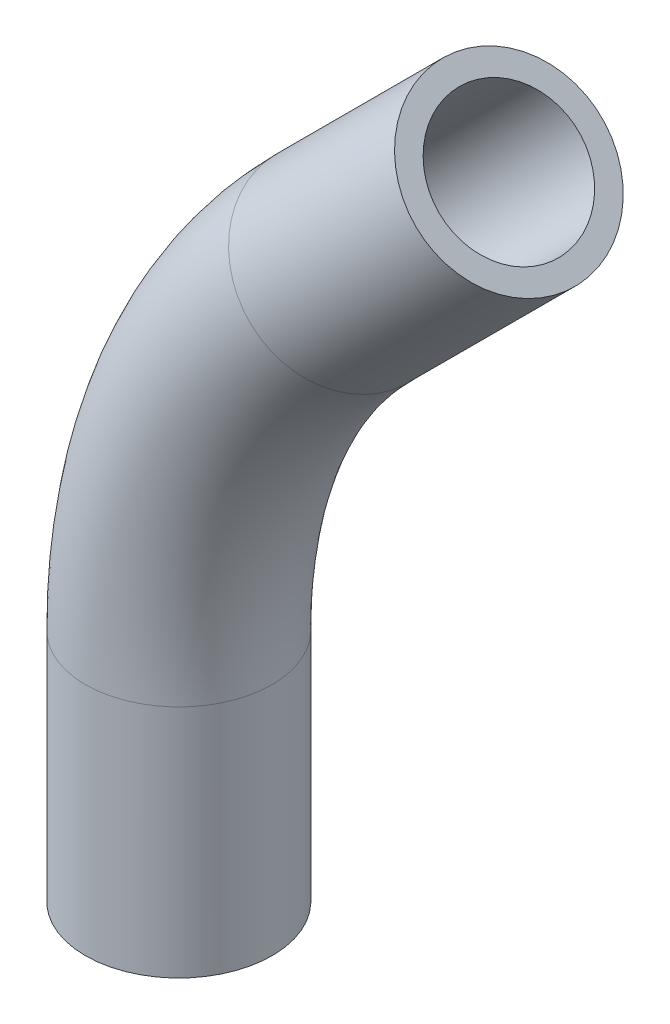
ISO-10303-21;
HEADER;
FILE_DESCRIPTION(('STEP AP214'),'2;1');
FILE_NAME('part.step','',(''),(''),'','','');
FILE_SCHEMA(('AUTOMOTIVE_DESIGN { 1 0 10303 214 1 1 1 1 }'));
ENDSEC;
DATA;
#1=APPLICATION_CONTEXT('core data for automotive mechanical design processes');
#2=APPLICATION_PROTOCOL_DEFINITION('international standard','automotive_design',2000,#1);
#3=PRODUCT_CONTEXT('',#1,'mechanical');
#4=PRODUCT('Part','Part','',(#3));
#5=PRODUCT_RELATED_PRODUCT_CATEGORY('part','',(#4));
#6=PRODUCT_DEFINITION_FORMATION('','',#4);
#7=PRODUCT_DEFINITION_CONTEXT('part definition',#1,'design');
#8=PRODUCT_DEFINITION('design','',#6,#7);
#9=PRODUCT_DEFINITION_SHAPE('','',#8);
#10=(LENGTH_UNIT() NAMED_UNIT(*) SI_UNIT(.MILLI.,.METRE.));
#11=(NAMED_UNIT(*) PLANE_ANGLE_UNIT() SI_UNIT($,.RADIAN.));
#12=(NAMED_UNIT(*) SI_UNIT($,.STERADIAN.) SOLID_ANGLE_UNIT());
#13=UNCERTAINTY_MEASURE_WITH_UNIT(LENGTH_MEASURE(1.E-05),#10,'distance_accuracy_value','');
#14=(GEOMETRIC_REPRESENTATION_CONTEXT(3) GLOBAL_UNCERTAINTY_ASSIGNED_CONTEXT((#13)) GLOBAL_UNIT_ASSIGNED_CONTEXT((#10,
#11,#12)) REPRESENTATION_CONTEXT('',''));
#15=CARTESIAN_POINT('',(0.,0.,0.));
#16=DIRECTION('',(0.,0.,1.));
#17=DIRECTION('',(1.,0.,0.));
#18=AXIS2_PLACEMENT_3D('',#15,#16,#17);
#19=CARTESIAN_POINT('',(0.,0.,0.));
#20=DIRECTION('',(0.,1.,0.));
#21=DIRECTION('',(0.,0.,1.));
#22=AXIS2_PLACEMENT_3D('',#19,#20,#21);
#23=CYLINDRICAL_SURFACE('',#22,4.);
#24=CARTESIAN_POINT('',(0.,10.0588745030457,0.));
#25=DIRECTION('',(0.,1.,0.));
#26=DIRECTION('',(0.,0.,1.));
#27=AXIS2_PLACEMENT_3D('',#24,#25,#26);
#28=CIRCLE('',#27,4.);
#29=CARTESIAN_POINT('',(-4.,10.0588745030457,0.));
#30=VERTEX_POINT('',#29);
#31=EDGE_CURVE('E80',#30,#30,#28,.T.);
#32=ORIENTED_EDGE('',*,*,#31,.F.);
#33=EDGE_LOOP('',(#32));
#34=FACE_BOUND('',#33,.T.);
#35=CARTESIAN_POINT('',(0.,0.,0.));
#36=DIRECTION('',(0.,1.,0.));
#37=DIRECTION('',(0.,0.,1.));
#38=AXIS2_PLACEMENT_3D('',#35,#36,#37);
#39=CIRCLE('',#38,4.);
#40=CARTESIAN_POINT('',(0.,0.,4.));
#41=VERTEX_POINT('',#40);
#42=EDGE_CURVE('E49',#41,#41,#39,.T.);
#43=ORIENTED_EDGE('',*,*,#42,.T.);
#44=EDGE_LOOP('',(#43));
#45=FACE_BOUND('',#44,.T.);
#46=ADVANCED_FACE('F34',(#34,#45),#23,.T.);
#47=CARTESIAN_POINT('',(24.,10.0588745030457,0.));
#48=DIRECTION('',(0.,0.,-1.));
#49=DIRECTION('',(-1.,0.,0.));
#50=AXIS2_PLACEMENT_3D('',#47,#48,#49);
#51=TOROIDAL_SURFACE('',#50,24.,4.);
#52=CARTESIAN_POINT('',(7.02943725152288,27.0294372515229,0.));
#53=DIRECTION('',(0.707106781186548,0.707106781186547,0.));
#54=DIRECTION('',(0.,0.,1.));
#55=AXIS2_PLACEMENT_3D('',#52,#53,#54);
#56=CIRCLE('',#55,4.);
#57=CARTESIAN_POINT('',(4.20101012677669,29.8578643762691,0.));
#58=VERTEX_POINT('',#57);
#59=EDGE_CURVE('E38',#58,#58,#56,.T.);
#60=CARTESIAN_POINT('',(24.,10.0588745030457,0.));
#61=DIRECTION('',(0.,0.,-1.));
#62=DIRECTION('',(-1.,0.,0.));
#63=AXIS2_PLACEMENT_3D('',#60,#61,#62);
#64=CIRCLE('',#63,28.);
#65=EDGE_CURVE('',#30,#58,#64,.T.);
#66=ORIENTED_EDGE('',*,*,#31,.T.);
#67=ORIENTED_EDGE('',*,*,#59,.F.);
#68=ORIENTED_EDGE('',*,*,#65,.T.);
#69=ORIENTED_EDGE('',*,*,#65,.F.);
#70=EDGE_LOOP('',(#66,#68,#67,#69));
#71=FACE_BOUND('',#70,.T.);
#72=ADVANCED_FACE('F88',(#71),#51,.T.);
#73=CARTESIAN_POINT('',(7.02943725152288,27.0294372515229,0.));
#74=DIRECTION('',(0.707106781186548,0.707106781186547,0.));
#75=DIRECTION('',(-0.707106781186547,0.707106781186548,0.));
#76=AXIS2_PLACEMENT_3D('',#73,#74,#75);
#77=CYLINDRICAL_SURFACE('',#76,4.);
#78=CARTESIAN_POINT('',(14.142135623731,34.1421356237309,0.));
#79=DIRECTION('',(0.707106781186548,0.707106781186547,0.));
#80=DIRECTION('',(0.,0.,1.));
#81=AXIS2_PLACEMENT_3D('',#78,#79,#80);
#82=CIRCLE('',#81,4.);
#83=CARTESIAN_POINT('',(14.142135623731,34.1421356237309,4.));
#84=VERTEX_POINT('',#83);
#85=EDGE_CURVE('E54',#84,#84,#82,.T.);
#86=ORIENTED_EDGE('',*,*,#85,.F.);
#87=EDGE_LOOP('',(#86));
#88=FACE_BOUND('',#87,.T.);
#89=ORIENTED_EDGE('',*,*,#59,.T.);
#90=EDGE_LOOP('',(#89));
#91=FACE_BOUND('',#90,.T.);
#92=ADVANCED_FACE('F36',(#88,#91),#77,.T.);
#93=CARTESIAN_POINT('',(0.,0.,0.));
#94=DIRECTION('',(0.,1.,0.));
#95=DIRECTION('',(0.,0.,1.));
#96=AXIS2_PLACEMENT_3D('',#93,#94,#95);
#97=PLANE('',#96);
#98=CARTESIAN_POINT('',(0.,0.,0.));
#99=DIRECTION('',(0.,1.,0.));
#100=DIRECTION('',(0.,0.,1.));
#101=AXIS2_PLACEMENT_3D('',#98,#99,#100);
#102=CIRCLE('',#101,3.);
#103=CARTESIAN_POINT('',(0.,0.,3.));
#104=VERTEX_POINT('',#103);
#105=EDGE_CURVE('E75',#104,#104,#102,.F.);
#106=ORIENTED_EDGE('',*,*,#105,.F.);
#107=EDGE_LOOP('',(#106));
#108=FACE_BOUND('',#107,.T.);
#109=ORIENTED_EDGE('',*,*,#42,.F.);
#110=EDGE_LOOP('',(#109));
#111=FACE_BOUND('',#110,.T.);
#112=ADVANCED_FACE('F94',(#108,#111),#97,.F.);
#113=CARTESIAN_POINT('',(14.142135623731,34.1421356237309,0.));
#114=DIRECTION('',(0.707106781186548,0.707106781186547,0.));
#115=DIRECTION('',(0.,0.,1.));
#116=AXIS2_PLACEMENT_3D('',#113,#114,#115);
#117=PLANE('',#116);
#118=CARTESIAN_POINT('',(14.142135623731,34.1421356237309,0.));
#119=DIRECTION('',(0.707106781186548,0.707106781186547,0.));
#120=DIRECTION('',(0.,0.,1.));
#121=AXIS2_PLACEMENT_3D('',#118,#119,#120);
#122=CIRCLE('',#121,3.);
#123=CARTESIAN_POINT('',(14.142135623731,34.1421356237309,3.));
#124=VERTEX_POINT('',#123);
#125=EDGE_CURVE('E11',#124,#124,#122,.F.);
#126=ORIENTED_EDGE('',*,*,#125,.T.);
#127=EDGE_LOOP('',(#126));
#128=FACE_BOUND('',#127,.T.);
#129=ORIENTED_EDGE('',*,*,#85,.T.);
#130=EDGE_LOOP('',(#129));
#131=FACE_BOUND('',#130,.T.);
#132=ADVANCED_FACE('F61',(#128,#131),#117,.T.);
#133=CARTESIAN_POINT('',(0.,0.,0.));
#134=DIRECTION('',(0.,1.,0.));
#135=DIRECTION('',(0.,0.,1.));
#136=AXIS2_PLACEMENT_3D('',#133,#134,#135);
#137=CYLINDRICAL_SURFACE('',#136,3.);
#138=CARTESIAN_POINT('',(0.,10.0588745030457,0.));
#139=DIRECTION('',(0.,1.,0.));
#140=DIRECTION('',(0.,0.,1.));
#141=AXIS2_PLACEMENT_3D('',#138,#139,#140);
#142=CIRCLE('',#141,3.);
#143=CARTESIAN_POINT('',(-3.,10.0588745030457,0.));
#144=VERTEX_POINT('',#143);
#145=EDGE_CURVE('E72',#144,#144,#142,.F.);
#146=ORIENTED_EDGE('',*,*,#145,.F.);
#147=EDGE_LOOP('',(#146));
#148=FACE_BOUND('',#147,.T.);
#149=ORIENTED_EDGE('',*,*,#105,.T.);
#150=EDGE_LOOP('',(#149));
#151=FACE_BOUND('',#150,.T.);
#152=ADVANCED_FACE('F102',(#148,#151),#137,.F.);
#153=CARTESIAN_POINT('',(24.,10.0588745030457,0.));
#154=DIRECTION('',(0.,0.,-1.));
#155=DIRECTION('',(-1.,0.,0.));
#156=AXIS2_PLACEMENT_3D('',#153,#154,#155);
#157=TOROIDAL_SURFACE('',#156,24.,3.);
#158=CARTESIAN_POINT('',(7.02943725152288,27.0294372515229,0.));
#159=DIRECTION('',(0.707106781186548,0.707106781186547,0.));
#160=DIRECTION('',(0.,0.,1.));
#161=AXIS2_PLACEMENT_3D('',#158,#159,#160);
#162=CIRCLE('',#161,3.);
#163=CARTESIAN_POINT('',(4.90811690796324,29.1507575950825,0.));
#164=VERTEX_POINT('',#163);
#165=EDGE_CURVE('E43',#164,#164,#162,.F.);
#166=CARTESIAN_POINT('',(24.,10.0588745030457,0.));
#167=DIRECTION('',(0.,0.,-1.));
#168=DIRECTION('',(-1.,0.,0.));
#169=AXIS2_PLACEMENT_3D('',#166,#167,#168);
#170=CIRCLE('',#169,27.);
#171=EDGE_CURVE('',#144,#164,#170,.T.);
#172=ORIENTED_EDGE('',*,*,#145,.T.);
#173=ORIENTED_EDGE('',*,*,#165,.F.);
#174=ORIENTED_EDGE('',*,*,#171,.T.);
#175=ORIENTED_EDGE('',*,*,#171,.F.);
#176=EDGE_LOOP('',(#172,#174,#173,#175));
#177=FACE_BOUND('',#176,.T.);
#178=ADVANCED_FACE('F67',(#177),#157,.F.);
#179=CARTESIAN_POINT('',(7.02943725152288,27.0294372515229,0.));
#180=DIRECTION('',(0.707106781186548,0.707106781186547,0.));
#181=DIRECTION('',(-0.707106781186547,0.707106781186548,0.));
#182=AXIS2_PLACEMENT_3D('',#179,#180,#181);
#183=CYLINDRICAL_SURFACE('',#182,3.);
#184=ORIENTED_EDGE('',*,*,#125,.F.);
#185=EDGE_LOOP('',(#184));
#186=FACE_BOUND('',#185,.T.);
#187=ORIENTED_EDGE('',*,*,#165,.T.);
#188=EDGE_LOOP('',(#187));
#189=FACE_BOUND('',#188,.T.);
#190=ADVANCED_FACE('F64',(#186,#189),#183,.F.);
#191=CLOSED_SHELL('',(#46,#72,#92,#112,#132,#152,#178,#190));
#192=MANIFOLD_SOLID_BREP('B2',#191);
#193=ADVANCED_BREP_SHAPE_REPRESENTATION('',(#18,#192),#14);
#194=SHAPE_DEFINITION_REPRESENTATION(#9,#193);
ENDSEC;
END-ISO-10303-21;
